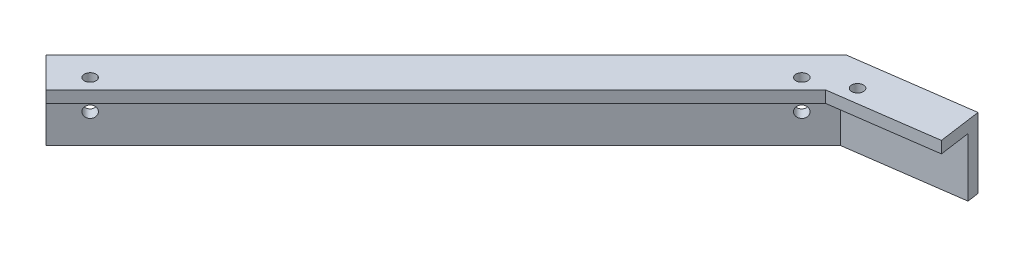
ISO-10303-21;
HEADER;
FILE_DESCRIPTION(('STEP AP214'),'2;1');
FILE_NAME('part.step','',(''),(''),'','','');
FILE_SCHEMA(('AUTOMOTIVE_DESIGN { 1 0 10303 214 1 1 1 1 }'));
ENDSEC;
DATA;
#1=APPLICATION_CONTEXT('core data for automotive mechanical design processes');
#2=APPLICATION_PROTOCOL_DEFINITION('international standard','automotive_design',2000,#1);
#3=PRODUCT_CONTEXT('',#1,'mechanical');
#4=PRODUCT('Part','Part','',(#3));
#5=PRODUCT_RELATED_PRODUCT_CATEGORY('part','',(#4));
#6=PRODUCT_DEFINITION_FORMATION('','',#4);
#7=PRODUCT_DEFINITION_CONTEXT('part definition',#1,'design');
#8=PRODUCT_DEFINITION('design','',#6,#7);
#9=PRODUCT_DEFINITION_SHAPE('','',#8);
#10=(LENGTH_UNIT() NAMED_UNIT(*) SI_UNIT(.MILLI.,.METRE.));
#11=(NAMED_UNIT(*) PLANE_ANGLE_UNIT() SI_UNIT($,.RADIAN.));
#12=(NAMED_UNIT(*) SI_UNIT($,.STERADIAN.) SOLID_ANGLE_UNIT());
#13=UNCERTAINTY_MEASURE_WITH_UNIT(LENGTH_MEASURE(1.E-05),#10,'distance_accuracy_value','');
#14=(GEOMETRIC_REPRESENTATION_CONTEXT(3) GLOBAL_UNCERTAINTY_ASSIGNED_CONTEXT((#13)) GLOBAL_UNIT_ASSIGNED_CONTEXT((#10,
#11,#12)) REPRESENTATION_CONTEXT('',''));
#15=CARTESIAN_POINT('',(0.,0.,0.));
#16=DIRECTION('',(0.,0.,1.));
#17=DIRECTION('',(1.,0.,0.));
#18=AXIS2_PLACEMENT_3D('',#15,#16,#17);
#19=CARTESIAN_POINT('',(0.,0.,0.));
#20=DIRECTION('',(0.,1.,0.));
#21=DIRECTION('',(0.,0.,1.));
#22=AXIS2_PLACEMENT_3D('',#19,#20,#21);
#23=PLANE('',#22);
#24=CARTESIAN_POINT('',(-56.0956256998048,0.,5.92639167808071));
#25=DIRECTION('',(0.,-1.,0.));
#26=DIRECTION('',(0.,0.,-1.));
#27=AXIS2_PLACEMENT_3D('',#24,#25,#26);
#28=CIRCLE('',#27,1.5);
#29=CARTESIAN_POINT('',(-56.0956256998048,0.,4.42639167808071));
#30=VERTEX_POINT('',#29);
#31=EDGE_CURVE('E133',#30,#30,#28,.T.);
#32=ORIENTED_EDGE('',*,*,#31,.F.);
#33=EDGE_LOOP('',(#32));
#34=FACE_BOUND('',#33,.T.);
#35=CARTESIAN_POINT('',(-65.6363961030679,0.,10.6773123959169));
#36=DIRECTION('',(0.,1.,0.));
#37=DIRECTION('',(0.,0.,1.));
#38=AXIS2_PLACEMENT_3D('',#35,#36,#37);
#39=CIRCLE('',#38,1.5);
#40=CARTESIAN_POINT('',(-65.6363961030679,0.,12.1773123959169));
#41=VERTEX_POINT('',#40);
#42=EDGE_CURVE('E175',#41,#41,#39,.T.);
#43=ORIENTED_EDGE('',*,*,#42,.T.);
#44=EDGE_LOOP('',(#43));
#45=FACE_BOUND('',#44,.T.);
#46=CARTESIAN_POINT('',(-156.853170876132,0.,101.894087168982));
#47=DIRECTION('',(0.,1.,0.));
#48=DIRECTION('',(0.,0.,1.));
#49=AXIS2_PLACEMENT_3D('',#46,#47,#48);
#50=CIRCLE('',#49,1.5);
#51=CARTESIAN_POINT('',(-156.853170876132,0.,103.394087168982));
#52=VERTEX_POINT('',#51);
#53=EDGE_CURVE('E182',#52,#52,#50,.T.);
#54=ORIENTED_EDGE('',*,*,#53,.T.);
#55=EDGE_LOOP('',(#54));
#56=FACE_BOUND('',#55,.T.);
#57=DIRECTION('',(-0.990406217253161,0.,0.138186558052092));
#58=VECTOR('',#57,1.);
#59=CARTESIAN_POINT('',(-34.8732538082489,0.,-1.17437808980328));
#60=LINE('',#59,#58);
#61=CARTESIAN_POINT('',(-34.8732538082489,0.,-1.17437808980328));
#62=VERTEX_POINT('',#61);
#63=CARTESIAN_POINT('',(-63.5896385971409,0.,2.83227928426094));
#64=VERTEX_POINT('',#63);
#65=EDGE_CURVE('E55',#62,#64,#60,.T.);
#66=ORIENTED_EDGE('',*,*,#65,.F.);
#67=DIRECTION('',(-0.138186558052092,0.,-0.990406217253161));
#68=VECTOR('',#67,1.);
#69=CARTESIAN_POINT('',(-33.7677613438322,0.,6.74887164822201));
#70=LINE('',#69,#68);
#71=CARTESIAN_POINT('',(-33.7677613438322,0.,6.74887164822201));
#72=VERTEX_POINT('',#71);
#73=EDGE_CURVE('E150',#72,#62,#70,.T.);
#74=ORIENTED_EDGE('',*,*,#73,.F.);
#75=DIRECTION('',(-0.990406217253162,0.,0.138186558052089));
#76=VECTOR('',#75,1.);
#77=CARTESIAN_POINT('',(0.278843024864548,0.,1.99851468447044));
#78=LINE('',#77,#76);
#79=CARTESIAN_POINT('',(-59.8286748561873,0.,10.3850240422906));
#80=VERTEX_POINT('',#79);
#81=EDGE_CURVE('E152',#72,#80,#78,.T.);
#82=ORIENTED_EDGE('',*,*,#81,.T.);
#83=DIRECTION('',(0.707106781186545,0.,-0.70710678118655));
#84=VECTOR('',#83,1.);
#85=CARTESIAN_POINT('',(-159.752308678997,0.,110.308657865101));
#86=LINE('',#85,#84);
#87=CARTESIAN_POINT('',(-159.752308678997,0.,110.308657865101));
#88=VERTEX_POINT('',#87);
#89=EDGE_CURVE('E187',#88,#80,#86,.T.);
#90=ORIENTED_EDGE('',*,*,#89,.F.);
#91=DIRECTION('',(0.707106781186548,0.,0.707106781186547));
#92=VECTOR('',#91,1.);
#93=CARTESIAN_POINT('',(-167.530483272049,0.,102.530483272049));
#94=LINE('',#93,#92);
#95=CARTESIAN_POINT('',(-165.40916292849,0.,104.651803615609));
#96=VERTEX_POINT('',#95);
#97=EDGE_CURVE('E194',#96,#88,#94,.T.);
#98=ORIENTED_EDGE('',*,*,#97,.F.);
#99=DIRECTION('',(-0.70710678118655,0.,0.707106781186545));
#100=VECTOR('',#99,1.);
#101=CARTESIAN_POINT('',(-63.7573593128799,0.,3.));
#102=LINE('',#101,#100);
#103=EDGE_CURVE('E51',#64,#96,#102,.T.);
#104=ORIENTED_EDGE('',*,*,#103,.F.);
#105=EDGE_LOOP('',(#66,#74,#82,#90,#98,#104));
#106=FACE_BOUND('',#105,.T.);
#107=ADVANCED_FACE('F34',(#34,#45,#56,#106),#23,.F.);
#108=CARTESIAN_POINT('',(-159.752308678997,0.,110.308657865101));
#109=DIRECTION('',(0.70710678118655,0.,0.707106781186545));
#110=DIRECTION('',(0.707106781186545,0.,-0.70710678118655));
#111=AXIS2_PLACEMENT_3D('',#108,#109,#110);
#112=PLANE('',#111);
#113=DIRECTION('',(0.,-1.,0.));
#114=VECTOR('',#113,1.);
#115=CARTESIAN_POINT('',(-59.8286748561873,6.,10.3850240422906));
#116=LINE('',#115,#114);
#117=CARTESIAN_POINT('',(-59.8286748561873,3.,10.3850240422906));
#118=VERTEX_POINT('',#117);
#119=EDGE_CURVE('E158',#118,#80,#116,.T.);
#120=ORIENTED_EDGE('',*,*,#119,.F.);
#121=DIRECTION('',(0.707106781186545,0.,-0.70710678118655));
#122=VECTOR('',#121,1.);
#123=CARTESIAN_POINT('',(-159.752308678997,3.,110.308657865101));
#124=LINE('',#123,#122);
#125=CARTESIAN_POINT('',(-159.752308678997,3.,110.308657865101));
#126=VERTEX_POINT('',#125);
#127=EDGE_CURVE('E178',#126,#118,#124,.T.);
#128=ORIENTED_EDGE('',*,*,#127,.F.);
#129=DIRECTION('',(0.,1.,0.));
#130=VECTOR('',#129,1.);
#131=CARTESIAN_POINT('',(-159.752308678997,0.,110.308657865101));
#132=LINE('',#131,#130);
#133=EDGE_CURVE('E190',#88,#126,#132,.T.);
#134=ORIENTED_EDGE('',*,*,#133,.F.);
#135=ORIENTED_EDGE('',*,*,#89,.T.);
#136=EDGE_LOOP('',(#120,#128,#134,#135));
#137=FACE_BOUND('',#136,.T.);
#138=ADVANCED_FACE('F221',(#137),#112,.T.);
#139=CARTESIAN_POINT('',(-65.,6.,0.));
#140=DIRECTION('',(0.138186558052092,0.,0.990406217253161));
#141=DIRECTION('',(0.990406217253161,0.,-0.138186558052092));
#142=AXIS2_PLACEMENT_3D('',#139,#140,#141);
#143=PLANE('',#142);
#144=CARTESIAN_POINT('',(-57.0767502619747,-4.1,-1.10549246441674));
#145=DIRECTION('',(-0.138186558052092,0.,-0.990406217253161));
#146=DIRECTION('',(-0.990406217253161,0.,0.138186558052092));
#147=AXIS2_PLACEMENT_3D('',#144,#145,#146);
#148=CIRCLE('',#147,1.5);
#149=CARTESIAN_POINT('',(-58.5623595878544,-4.1,-0.8982126273386));
#150=VERTEX_POINT('',#149);
#151=EDGE_CURVE('E210',#150,#150,#148,.T.);
#152=ORIENTED_EDGE('',*,*,#151,.F.);
#153=EDGE_LOOP('',(#152));
#154=FACE_BOUND('',#153,.T.);
#155=DIRECTION('',(-0.990406217253161,0.,0.138186558052092));
#156=VECTOR('',#155,1.);
#157=CARTESIAN_POINT('',(-65.,3.,0.));
#158=LINE('',#157,#156);
#159=CARTESIAN_POINT('',(-35.2878134824052,3.,-4.14559674156276));
#160=VERTEX_POINT('',#159);
#161=CARTESIAN_POINT('',(-65.,3.,0.));
#162=VERTEX_POINT('',#161);
#163=EDGE_CURVE('E144',#160,#162,#158,.T.);
#164=ORIENTED_EDGE('',*,*,#163,.F.);
#165=DIRECTION('',(0.,-1.,0.));
#166=VECTOR('',#165,1.);
#167=CARTESIAN_POINT('',(-35.2878134824052,6.,-4.14559674156276));
#168=LINE('',#167,#166);
#169=CARTESIAN_POINT('',(-35.2878134824052,-15.,-4.14559674156276));
#170=VERTEX_POINT('',#169);
#171=EDGE_CURVE('E125',#160,#170,#168,.T.);
#172=ORIENTED_EDGE('',*,*,#171,.T.);
#173=DIRECTION('',(0.990406217253161,0.,-0.138186558052092));
#174=VECTOR('',#173,1.);
#175=CARTESIAN_POINT('',(-65.,-15.,0.));
#176=LINE('',#175,#174);
#177=CARTESIAN_POINT('',(-65.,-15.,0.));
#178=VERTEX_POINT('',#177);
#179=EDGE_CURVE('E117',#178,#170,#176,.T.);
#180=ORIENTED_EDGE('',*,*,#179,.F.);
#181=DIRECTION('',(0.,-1.,0.));
#182=VECTOR('',#181,1.);
#183=CARTESIAN_POINT('',(-65.,3.,0.));
#184=LINE('',#183,#182);
#185=EDGE_CURVE('E11',#162,#178,#184,.T.);
#186=ORIENTED_EDGE('',*,*,#185,.F.);
#187=EDGE_LOOP('',(#164,#172,#180,#186));
#188=FACE_BOUND('',#187,.T.);
#189=ADVANCED_FACE('F123',(#154,#188),#143,.F.);
#190=CARTESIAN_POINT('',(-35.2878134824052,6.,-4.14559674156276));
#191=DIRECTION('',(-0.990406217253161,0.,0.138186558052092));
#192=DIRECTION('',(0.138186558052092,0.,0.990406217253161));
#193=AXIS2_PLACEMENT_3D('',#190,#191,#192);
#194=PLANE('',#193);
#195=DIRECTION('',(-0.138186558052092,0.,-0.990406217253161));
#196=VECTOR('',#195,1.);
#197=CARTESIAN_POINT('',(-35.2878134824052,3.,-4.14559674156276));
#198=LINE('',#197,#196);
#199=CARTESIAN_POINT('',(-33.7677613438322,3.,6.74887164822201));
#200=VERTEX_POINT('',#199);
#201=EDGE_CURVE('E146',#200,#160,#198,.T.);
#202=ORIENTED_EDGE('',*,*,#201,.F.);
#203=DIRECTION('',(0.,-1.,0.));
#204=VECTOR('',#203,1.);
#205=CARTESIAN_POINT('',(-33.7677613438322,6.,6.74887164822201));
#206=LINE('',#205,#204);
#207=EDGE_CURVE('E156',#200,#72,#206,.T.);
#208=ORIENTED_EDGE('',*,*,#207,.T.);
#209=ORIENTED_EDGE('',*,*,#73,.T.);
#210=DIRECTION('',(0.,1.,0.));
#211=VECTOR('',#210,1.);
#212=CARTESIAN_POINT('',(-34.8732538082489,-15.,-1.17437808980328));
#213=LINE('',#212,#211);
#214=CARTESIAN_POINT('',(-34.8732538082489,-15.,-1.17437808980328));
#215=VERTEX_POINT('',#214);
#216=EDGE_CURVE('E141',#215,#62,#213,.T.);
#217=ORIENTED_EDGE('',*,*,#216,.F.);
#218=DIRECTION('',(0.138186558052091,0.,0.990406217253161));
#219=VECTOR('',#218,1.);
#220=CARTESIAN_POINT('',(-35.2878134824052,-15.,-4.14559674156276));
#221=LINE('',#220,#219);
#222=EDGE_CURVE('E126',#170,#215,#221,.T.);
#223=ORIENTED_EDGE('',*,*,#222,.F.);
#224=ORIENTED_EDGE('',*,*,#171,.F.);
#225=EDGE_LOOP('',(#202,#208,#209,#217,#223,#224));
#226=FACE_BOUND('',#225,.T.);
#227=ADVANCED_FACE('F220',(#226),#194,.F.);
#228=CARTESIAN_POINT('',(-33.7677613438322,6.,6.74887164822201));
#229=DIRECTION('',(-0.138186558052089,0.,-0.990406217253162));
#230=DIRECTION('',(-0.990406217253162,0.,0.138186558052089));
#231=AXIS2_PLACEMENT_3D('',#228,#229,#230);
#232=PLANE('',#231);
#233=DIRECTION('',(0.990406217253162,0.,-0.138186558052089));
#234=VECTOR('',#233,1.);
#235=CARTESIAN_POINT('',(-33.7677613438322,3.,6.74887164822201));
#236=LINE('',#235,#234);
#237=EDGE_CURVE('E148',#118,#200,#236,.T.);
#238=ORIENTED_EDGE('',*,*,#237,.F.);
#239=ORIENTED_EDGE('',*,*,#119,.T.);
#240=ORIENTED_EDGE('',*,*,#81,.F.);
#241=ORIENTED_EDGE('',*,*,#207,.F.);
#242=EDGE_LOOP('',(#238,#239,#240,#241));
#243=FACE_BOUND('',#242,.T.);
#244=ADVANCED_FACE('F227',(#243),#232,.F.);
#245=CARTESIAN_POINT('',(0.,3.,0.));
#246=DIRECTION('',(0.,1.,0.));
#247=DIRECTION('',(0.,0.,1.));
#248=AXIS2_PLACEMENT_3D('',#245,#246,#247);
#249=PLANE('',#248);
#250=CARTESIAN_POINT('',(-56.0956256998048,3.,5.92639167808071));
#251=DIRECTION('',(0.,1.,0.));
#252=DIRECTION('',(0.,0.,1.));
#253=AXIS2_PLACEMENT_3D('',#250,#251,#252);
#254=CIRCLE('',#253,1.5);
#255=CARTESIAN_POINT('',(-56.0956256998048,3.,7.4263916780807));
#256=VERTEX_POINT('',#255);
#257=EDGE_CURVE('E130',#256,#256,#254,.T.);
#258=ORIENTED_EDGE('',*,*,#257,.F.);
#259=EDGE_LOOP('',(#258));
#260=FACE_BOUND('',#259,.T.);
#261=ORIENTED_EDGE('',*,*,#127,.T.);
#262=ORIENTED_EDGE('',*,*,#237,.T.);
#263=ORIENTED_EDGE('',*,*,#201,.T.);
#264=ORIENTED_EDGE('',*,*,#163,.T.);
#265=DIRECTION('',(-0.707106781186547,0.,0.707106781186548));
#266=VECTOR('',#265,1.);
#267=CARTESIAN_POINT('',(-65.,3.,0.));
#268=LINE('',#267,#266);
#269=CARTESIAN_POINT('',(-167.530483272049,3.,102.530483272049));
#270=VERTEX_POINT('',#269);
#271=EDGE_CURVE('E110',#162,#270,#268,.T.);
#272=ORIENTED_EDGE('',*,*,#271,.T.);
#273=DIRECTION('',(0.707106781186548,0.,0.707106781186547));
#274=VECTOR('',#273,1.);
#275=CARTESIAN_POINT('',(-167.530483272049,3.,102.530483272049));
#276=LINE('',#275,#274);
#277=EDGE_CURVE('E196',#270,#126,#276,.T.);
#278=ORIENTED_EDGE('',*,*,#277,.T.);
#279=EDGE_LOOP('',(#261,#262,#263,#264,#272,#278));
#280=FACE_BOUND('',#279,.T.);
#281=CARTESIAN_POINT('',(-156.853170876132,3.,101.894087168982));
#282=DIRECTION('',(0.,1.,0.));
#283=DIRECTION('',(0.,0.,1.));
#284=AXIS2_PLACEMENT_3D('',#281,#282,#283);
#285=CIRCLE('',#284,1.5);
#286=CARTESIAN_POINT('',(-156.853170876132,3.,103.394087168982));
#287=VERTEX_POINT('',#286);
#288=EDGE_CURVE('E174',#287,#287,#285,.T.);
#289=ORIENTED_EDGE('',*,*,#288,.F.);
#290=EDGE_LOOP('',(#289));
#291=FACE_BOUND('',#290,.T.);
#292=CARTESIAN_POINT('',(-65.6363961030679,3.,10.6773123959169));
#293=DIRECTION('',(0.,1.,0.));
#294=DIRECTION('',(0.,0.,1.));
#295=AXIS2_PLACEMENT_3D('',#292,#293,#294);
#296=CIRCLE('',#295,1.5);
#297=CARTESIAN_POINT('',(-65.6363961030679,3.,12.1773123959169));
#298=VERTEX_POINT('',#297);
#299=EDGE_CURVE('E179',#298,#298,#296,.T.);
#300=ORIENTED_EDGE('',*,*,#299,.F.);
#301=EDGE_LOOP('',(#300));
#302=FACE_BOUND('',#301,.T.);
#303=ADVANCED_FACE('F240',(#260,#280,#291,#302),#249,.T.);
#304=CARTESIAN_POINT('',(-65.,3.,0.));
#305=DIRECTION('',(0.707106781186548,0.,0.707106781186547));
#306=DIRECTION('',(0.707106781186547,0.,-0.707106781186548));
#307=AXIS2_PLACEMENT_3D('',#304,#305,#306);
#308=PLANE('',#307);
#309=CARTESIAN_POINT('',(-161.873629022557,-7.5,96.873629022557));
#310=DIRECTION('',(-0.707106781186548,0.,-0.707106781186548));
#311=DIRECTION('',(-0.707106781186548,0.,0.707106781186548));
#312=AXIS2_PLACEMENT_3D('',#309,#310,#311);
#313=CIRCLE('',#312,1.49999999999999);
#314=CARTESIAN_POINT('',(-162.934289194337,-7.5,97.9342891943368));
#315=VERTEX_POINT('',#314);
#316=EDGE_CURVE('E161',#315,#315,#313,.T.);
#317=ORIENTED_EDGE('',*,*,#316,.F.);
#318=EDGE_LOOP('',(#317));
#319=FACE_BOUND('',#318,.T.);
#320=CARTESIAN_POINT('',(-70.6568542494924,-7.5,5.65685424949235));
#321=DIRECTION('',(-0.707106781186548,0.,-0.707106781186548));
#322=DIRECTION('',(-0.707106781186548,0.,0.707106781186548));
#323=AXIS2_PLACEMENT_3D('',#320,#321,#322);
#324=CIRCLE('',#323,1.5);
#325=CARTESIAN_POINT('',(-71.7175144212722,-7.5,6.71751442127217));
#326=VERTEX_POINT('',#325);
#327=EDGE_CURVE('E160',#326,#326,#324,.T.);
#328=ORIENTED_EDGE('',*,*,#327,.F.);
#329=EDGE_LOOP('',(#328));
#330=FACE_BOUND('',#329,.T.);
#331=ORIENTED_EDGE('',*,*,#185,.T.);
#332=DIRECTION('',(0.707106781186547,0.,-0.707106781186548));
#333=VECTOR('',#332,1.);
#334=CARTESIAN_POINT('',(-167.530483272049,-15.,102.530483272049));
#335=LINE('',#334,#333);
#336=CARTESIAN_POINT('',(-167.530483272049,-15.,102.530483272049));
#337=VERTEX_POINT('',#336);
#338=EDGE_CURVE('E108',#337,#178,#335,.T.);
#339=ORIENTED_EDGE('',*,*,#338,.F.);
#340=DIRECTION('',(0.,-1.,0.));
#341=VECTOR('',#340,1.);
#342=CARTESIAN_POINT('',(-167.530483272049,3.,102.530483272049));
#343=LINE('',#342,#341);
#344=EDGE_CURVE('E43',#270,#337,#343,.T.);
#345=ORIENTED_EDGE('',*,*,#344,.F.);
#346=ORIENTED_EDGE('',*,*,#271,.F.);
#347=EDGE_LOOP('',(#331,#339,#345,#346));
#348=FACE_BOUND('',#347,.T.);
#349=ADVANCED_FACE('F36',(#319,#330,#348),#308,.F.);
#350=CARTESIAN_POINT('',(-167.530483272049,3.,102.530483272049));
#351=DIRECTION('',(0.707106781186547,0.,-0.707106781186548));
#352=DIRECTION('',(-0.707106781186548,0.,-0.707106781186547));
#353=AXIS2_PLACEMENT_3D('',#350,#351,#352);
#354=PLANE('',#353);
#355=ORIENTED_EDGE('',*,*,#344,.T.);
#356=DIRECTION('',(-0.707106781186545,0.,-0.70710678118655));
#357=VECTOR('',#356,1.);
#358=CARTESIAN_POINT('',(-165.40916292849,-15.,104.651803615609));
#359=LINE('',#358,#357);
#360=CARTESIAN_POINT('',(-165.40916292849,-15.,104.651803615609));
#361=VERTEX_POINT('',#360);
#362=EDGE_CURVE('E120',#361,#337,#359,.T.);
#363=ORIENTED_EDGE('',*,*,#362,.F.);
#364=DIRECTION('',(0.,1.,0.));
#365=VECTOR('',#364,1.);
#366=CARTESIAN_POINT('',(-165.40916292849,-15.,104.651803615609));
#367=LINE('',#366,#365);
#368=EDGE_CURVE('E169',#361,#96,#367,.T.);
#369=ORIENTED_EDGE('',*,*,#368,.T.);
#370=ORIENTED_EDGE('',*,*,#97,.T.);
#371=ORIENTED_EDGE('',*,*,#133,.T.);
#372=ORIENTED_EDGE('',*,*,#277,.F.);
#373=EDGE_LOOP('',(#355,#363,#369,#370,#371,#372));
#374=FACE_BOUND('',#373,.T.);
#375=ADVANCED_FACE('F241',(#374),#354,.F.);
#376=CARTESIAN_POINT('',(-156.853170876132,0.,101.894087168982));
#377=DIRECTION('',(0.,1.,0.));
#378=DIRECTION('',(0.,0.,1.));
#379=AXIS2_PLACEMENT_3D('',#376,#377,#378);
#380=CYLINDRICAL_SURFACE('',#379,1.5);
#381=ORIENTED_EDGE('',*,*,#53,.F.);
#382=EDGE_LOOP('',(#381));
#383=FACE_BOUND('',#382,.T.);
#384=ORIENTED_EDGE('',*,*,#288,.T.);
#385=EDGE_LOOP('',(#384));
#386=FACE_BOUND('',#385,.T.);
#387=ADVANCED_FACE('F243',(#383,#386),#380,.F.);
#388=CARTESIAN_POINT('',(-65.6363961030679,0.,10.6773123959169));
#389=DIRECTION('',(0.,1.,0.));
#390=DIRECTION('',(0.,0.,1.));
#391=AXIS2_PLACEMENT_3D('',#388,#389,#390);
#392=CYLINDRICAL_SURFACE('',#391,1.5);
#393=ORIENTED_EDGE('',*,*,#42,.F.);
#394=EDGE_LOOP('',(#393));
#395=FACE_BOUND('',#394,.T.);
#396=ORIENTED_EDGE('',*,*,#299,.T.);
#397=EDGE_LOOP('',(#396));
#398=FACE_BOUND('',#397,.T.);
#399=ADVANCED_FACE('F249',(#395,#398),#392,.F.);
#400=CARTESIAN_POINT('',(-63.7573593128799,-15.,3.));
#401=DIRECTION('',(-0.707106781186545,0.,-0.70710678118655));
#402=DIRECTION('',(-0.70710678118655,0.,0.707106781186545));
#403=AXIS2_PLACEMENT_3D('',#400,#401,#402);
#404=PLANE('',#403);
#405=CARTESIAN_POINT('',(-159.752308678997,-7.5,98.9949493661166));
#406=DIRECTION('',(-0.707106781186545,0.,-0.70710678118655));
#407=DIRECTION('',(-0.70710678118655,0.,0.707106781186545));
#408=AXIS2_PLACEMENT_3D('',#405,#406,#407);
#409=CIRCLE('',#408,1.49999999999999);
#410=CARTESIAN_POINT('',(-160.812968850777,-7.5,100.055609537896));
#411=VERTEX_POINT('',#410);
#412=EDGE_CURVE('E171',#411,#411,#409,.T.);
#413=ORIENTED_EDGE('',*,*,#412,.T.);
#414=EDGE_LOOP('',(#413));
#415=FACE_BOUND('',#414,.T.);
#416=CARTESIAN_POINT('',(-68.5355339059324,-7.5,7.77817459305239));
#417=DIRECTION('',(-0.707106781186545,0.,-0.70710678118655));
#418=DIRECTION('',(-0.70710678118655,0.,0.707106781186545));
#419=AXIS2_PLACEMENT_3D('',#416,#417,#418);
#420=CIRCLE('',#419,1.5);
#421=CARTESIAN_POINT('',(-69.5961940777122,-7.5,8.8388347648322));
#422=VERTEX_POINT('',#421);
#423=EDGE_CURVE('E164',#422,#422,#420,.T.);
#424=ORIENTED_EDGE('',*,*,#423,.T.);
#425=EDGE_LOOP('',(#424));
#426=FACE_BOUND('',#425,.T.);
#427=DIRECTION('',(-0.70710678118655,0.,0.707106781186545));
#428=VECTOR('',#427,1.);
#429=CARTESIAN_POINT('',(-63.7573593128799,-15.,3.));
#430=LINE('',#429,#428);
#431=CARTESIAN_POINT('',(-63.5896385971409,-15.,2.83227928426094));
#432=VERTEX_POINT('',#431);
#433=EDGE_CURVE('E121',#432,#361,#430,.T.);
#434=ORIENTED_EDGE('',*,*,#433,.F.);
#435=DIRECTION('',(0.,1.,0.));
#436=VECTOR('',#435,1.);
#437=CARTESIAN_POINT('',(-63.5896385971409,-15.,2.83227928426094));
#438=LINE('',#437,#436);
#439=EDGE_CURVE('E137',#432,#64,#438,.T.);
#440=ORIENTED_EDGE('',*,*,#439,.T.);
#441=ORIENTED_EDGE('',*,*,#103,.T.);
#442=ORIENTED_EDGE('',*,*,#368,.F.);
#443=EDGE_LOOP('',(#434,#440,#441,#442));
#444=FACE_BOUND('',#443,.T.);
#445=ADVANCED_FACE('F268',(#415,#426,#444),#404,.F.);
#446=CARTESIAN_POINT('',(0.,-15.,0.));
#447=DIRECTION('',(0.,-1.,0.));
#448=DIRECTION('',(0.,0.,-1.));
#449=AXIS2_PLACEMENT_3D('',#446,#447,#448);
#450=PLANE('',#449);
#451=ORIENTED_EDGE('',*,*,#338,.T.);
#452=ORIENTED_EDGE('',*,*,#179,.T.);
#453=ORIENTED_EDGE('',*,*,#222,.T.);
#454=DIRECTION('',(-0.990406217253161,0.,0.138186558052092));
#455=VECTOR('',#454,1.);
#456=CARTESIAN_POINT('',(-34.8732538082489,-15.,-1.17437808980328));
#457=LINE('',#456,#455);
#458=EDGE_CURVE('E128',#215,#432,#457,.T.);
#459=ORIENTED_EDGE('',*,*,#458,.T.);
#460=ORIENTED_EDGE('',*,*,#433,.T.);
#461=ORIENTED_EDGE('',*,*,#362,.T.);
#462=EDGE_LOOP('',(#451,#452,#453,#459,#460,#461));
#463=FACE_BOUND('',#462,.T.);
#464=ADVANCED_FACE('F116',(#463),#450,.T.);
#465=CARTESIAN_POINT('',(-60.0502525316942,-7.5,16.2634559672906));
#466=DIRECTION('',(-0.707106781186547,0.,-0.707106781186547));
#467=DIRECTION('',(-0.707106781186548,0.,0.707106781186548));
#468=AXIS2_PLACEMENT_3D('',#465,#466,#467);
#469=CYLINDRICAL_SURFACE('',#468,1.5);
#470=ORIENTED_EDGE('',*,*,#327,.T.);
#471=EDGE_LOOP('',(#470));
#472=FACE_BOUND('',#471,.T.);
#473=ORIENTED_EDGE('',*,*,#423,.F.);
#474=EDGE_LOOP('',(#473));
#475=FACE_BOUND('',#474,.T.);
#476=ADVANCED_FACE('F283',(#472,#475),#469,.F.);
#477=CARTESIAN_POINT('',(-151.267027304759,-7.5,107.480230740355));
#478=DIRECTION('',(-0.707106781186547,0.,-0.707106781186547));
#479=DIRECTION('',(-0.707106781186548,0.,0.707106781186548));
#480=AXIS2_PLACEMENT_3D('',#477,#478,#479);
#481=CYLINDRICAL_SURFACE('',#480,1.49999999999999);
#482=ORIENTED_EDGE('',*,*,#316,.T.);
#483=EDGE_LOOP('',(#482));
#484=FACE_BOUND('',#483,.T.);
#485=ORIENTED_EDGE('',*,*,#412,.F.);
#486=EDGE_LOOP('',(#485));
#487=FACE_BOUND('',#486,.T.);
#488=ADVANCED_FACE('F280',(#484,#487),#481,.F.);
#489=CARTESIAN_POINT('',(-34.8732538082489,-15.,-1.17437808980328));
#490=DIRECTION('',(-0.138186558052092,0.,-0.990406217253161));
#491=DIRECTION('',(-0.990406217253161,0.,0.138186558052092));
#492=AXIS2_PLACEMENT_3D('',#489,#490,#491);
#493=PLANE('',#492);
#494=CARTESIAN_POINT('',(-56.6621905878184,-4.1,1.86572618734272));
#495=DIRECTION('',(-0.138186558052092,0.,-0.990406217253161));
#496=DIRECTION('',(-0.990406217253161,0.,0.138186558052092));
#497=AXIS2_PLACEMENT_3D('',#494,#495,#496);
#498=CIRCLE('',#497,1.5);
#499=CARTESIAN_POINT('',(-58.1477999136982,-4.1,2.07300602442086));
#500=VERTEX_POINT('',#499);
#501=EDGE_CURVE('E38',#500,#500,#498,.T.);
#502=ORIENTED_EDGE('',*,*,#501,.T.);
#503=EDGE_LOOP('',(#502));
#504=FACE_BOUND('',#503,.T.);
#505=ORIENTED_EDGE('',*,*,#65,.T.);
#506=ORIENTED_EDGE('',*,*,#439,.F.);
#507=ORIENTED_EDGE('',*,*,#458,.F.);
#508=ORIENTED_EDGE('',*,*,#216,.T.);
#509=EDGE_LOOP('',(#505,#506,#507,#508));
#510=FACE_BOUND('',#509,.T.);
#511=ADVANCED_FACE('F266',(#504,#510),#493,.F.);
#512=CARTESIAN_POINT('',(-56.0956256998048,15.,5.92639167808071));
#513=DIRECTION('',(0.,-1.,0.));
#514=DIRECTION('',(0.,0.,-1.));
#515=AXIS2_PLACEMENT_3D('',#512,#513,#514);
#516=CYLINDRICAL_SURFACE('',#515,1.5);
#517=ORIENTED_EDGE('',*,*,#257,.T.);
#518=EDGE_LOOP('',(#517));
#519=FACE_BOUND('',#518,.T.);
#520=ORIENTED_EDGE('',*,*,#31,.T.);
#521=EDGE_LOOP('',(#520));
#522=FACE_BOUND('',#521,.T.);
#523=ADVANCED_FACE('F331',(#519,#522),#516,.F.);
#524=CARTESIAN_POINT('',(-41.3834202169767,-4.1,111.371233673538));
#525=DIRECTION('',(-0.138186558052092,0.,-0.990406217253161));
#526=DIRECTION('',(-0.990406217253161,0.,0.138186558052092));
#527=AXIS2_PLACEMENT_3D('',#524,#525,#526);
#528=CYLINDRICAL_SURFACE('',#527,1.5);
#529=ORIENTED_EDGE('',*,*,#151,.T.);
#530=EDGE_LOOP('',(#529));
#531=FACE_BOUND('',#530,.T.);
#532=ORIENTED_EDGE('',*,*,#501,.F.);
#533=EDGE_LOOP('',(#532));
#534=FACE_BOUND('',#533,.T.);
#535=ADVANCED_FACE('F216',(#531,#534),#528,.F.);
#536=CLOSED_SHELL('',(#107,#138,#189,#227,#244,#303,#349,#375,#387,#399,#445,#464,#476,#488,
#511,#523,#535));
#537=MANIFOLD_SOLID_BREP('B2',#536);
#538=ADVANCED_BREP_SHAPE_REPRESENTATION('',(#18,#537),#14);
#539=SHAPE_DEFINITION_REPRESENTATION(#9,#538);
ENDSEC;
END-ISO-10303-21;
